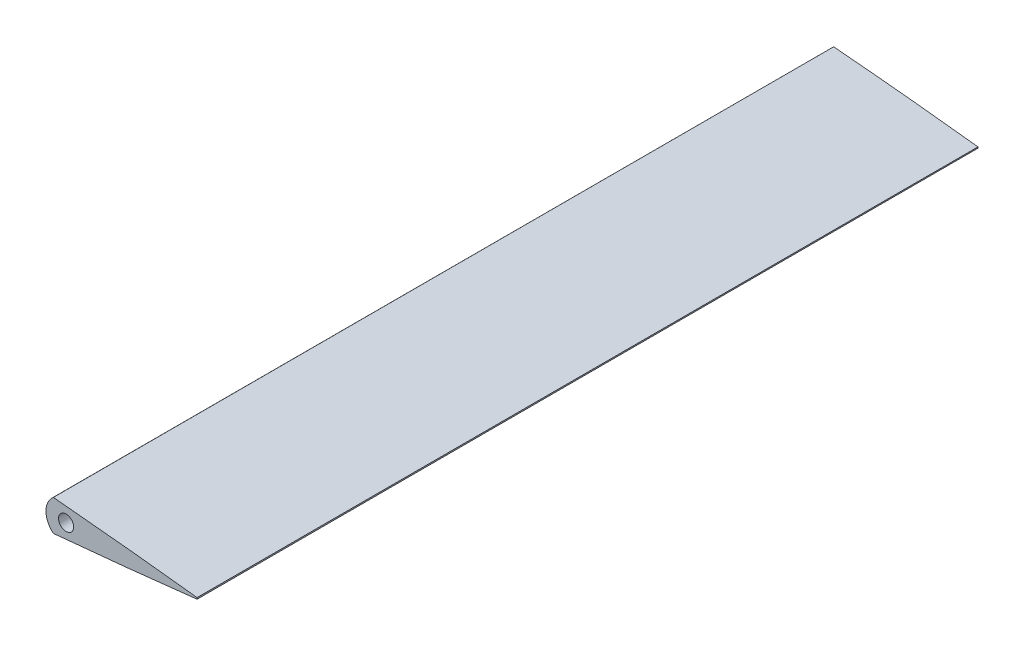
ISO-10303-21;
HEADER;
FILE_DESCRIPTION(('STEP AP214'),'2;1');
FILE_NAME('part.step','',(''),(''),'','','');
FILE_SCHEMA(('AUTOMOTIVE_DESIGN { 1 0 10303 214 1 1 1 1 }'));
ENDSEC;
DATA;
#1=APPLICATION_CONTEXT('core data for automotive mechanical design processes');
#2=APPLICATION_PROTOCOL_DEFINITION('international standard','automotive_design',2000,#1);
#3=PRODUCT_CONTEXT('',#1,'mechanical');
#4=PRODUCT('Part','Part','',(#3));
#5=PRODUCT_RELATED_PRODUCT_CATEGORY('part','',(#4));
#6=PRODUCT_DEFINITION_FORMATION('','',#4);
#7=PRODUCT_DEFINITION_CONTEXT('part definition',#1,'design');
#8=PRODUCT_DEFINITION('design','',#6,#7);
#9=PRODUCT_DEFINITION_SHAPE('','',#8);
#10=(LENGTH_UNIT() NAMED_UNIT(*) SI_UNIT(.MILLI.,.METRE.));
#11=(NAMED_UNIT(*) PLANE_ANGLE_UNIT() SI_UNIT($,.RADIAN.));
#12=(NAMED_UNIT(*) SI_UNIT($,.STERADIAN.) SOLID_ANGLE_UNIT());
#13=UNCERTAINTY_MEASURE_WITH_UNIT(LENGTH_MEASURE(1.E-05),#10,'distance_accuracy_value','');
#14=(GEOMETRIC_REPRESENTATION_CONTEXT(3) GLOBAL_UNCERTAINTY_ASSIGNED_CONTEXT((#13)) GLOBAL_UNIT_ASSIGNED_CONTEXT((#10,
#11,#12)) REPRESENTATION_CONTEXT('',''));
#15=CARTESIAN_POINT('',(0.,0.,0.));
#16=DIRECTION('',(0.,0.,1.));
#17=DIRECTION('',(1.,0.,0.));
#18=AXIS2_PLACEMENT_3D('',#15,#16,#17);
#19=CARTESIAN_POINT('',(70.,0.0735,0.));
#20=CARTESIAN_POINT('',(70.,0.05775,-90.));
#21=CARTESIAN_POINT('',(68.8335080399569,0.207369644620947,0.));
#22=CARTESIAN_POINT('',(69.0834706028233,0.162933292202173,-90.));
#23=CARTESIAN_POINT('',(66.5013366610328,0.475015684530368,0.));
#24=CARTESIAN_POINT('',(67.2510502336686,0.373226609273861,-90.));
#25=CARTESIAN_POINT('',(59.5068534375464,1.22059950301267,0.));
#26=CARTESIAN_POINT('',(61.7553848437865,0.959042466652812,-90.));
#27=CARTESIAN_POINT('',(51.3411291423464,1.97323482674955,0.));
#28=CARTESIAN_POINT('',(55.3394586118436,1.55039879244607,-90.));
#29=CARTESIAN_POINT('',(42.0033550763474,2.6781420115594,0.));
#30=CARTESIAN_POINT('',(48.0026361314158,2.10425443765382,-90.));
#31=CARTESIAN_POINT('',(35.0033276822841,3.10894088739879,0.));
#32=CARTESIAN_POINT('',(42.5026146075089,2.44273926867048,-90.));
#33=CARTESIAN_POINT('',(28.0028425035665,3.41546324526182,0.));
#34=CARTESIAN_POINT('',(37.0022333956594,2.68357826413429,-90.));
#35=CARTESIAN_POINT('',(20.9996176811236,3.54412790887703,0.));
#36=CARTESIAN_POINT('',(31.4996996065971,2.78467192840338,-90.));
#37=CARTESIAN_POINT('',(15.1621219043051,3.43896686269696,0.));
#38=CARTESIAN_POINT('',(26.913095781954,2.70204539211904,-90.));
#39=CARTESIAN_POINT('',(10.4932470006794,3.14283251784594,0.));
#40=CARTESIAN_POINT('',(23.2446940719624,2.46936840687895,-90.));
#41=CARTESIAN_POINT('',(7.57533938887657,2.83324720582861,0.));
#42=CARTESIAN_POINT('',(20.9520523769744,2.22612280457962,-90.));
#43=CARTESIAN_POINT('',(5.24030650692798,2.46209864989354,0.));
#44=CARTESIAN_POINT('',(19.1173836840148,1.93450608205921,-90.));
#45=CARTESIAN_POINT('',(3.48530508189471,2.09967851116287,0.));
#46=CARTESIAN_POINT('',(17.7384539929173,1.64974740162797,-90.));
#47=CARTESIAN_POINT('',(1.99314144537641,1.63920813156458,0.));
#48=CARTESIAN_POINT('',(16.5660397070815,1.28794924622931,-90.));
#49=CARTESIAN_POINT('',(0.755632776345661,1.11827318057108,0.));
#50=CARTESIAN_POINT('',(15.5937114671287,0.878643213305847,-90.));
#51=CARTESIAN_POINT('',(-0.447448608869755,0.,0.));
#52=CARTESIAN_POINT('',(14.648433235888,0.,-90.));
#53=CARTESIAN_POINT('',(0.755632776345677,-1.11827318057109,0.));
#54=CARTESIAN_POINT('',(15.5937114671287,-0.878643213305856,-90.));
#55=CARTESIAN_POINT('',(1.99314144537639,-1.63920813156457,0.));
#56=CARTESIAN_POINT('',(16.5660397070814,-1.2879492462293,-90.));
#57=CARTESIAN_POINT('',(3.48530508189473,-2.09967851116288,0.));
#58=CARTESIAN_POINT('',(17.7384539929173,-1.64974740162797,-90.));
#59=CARTESIAN_POINT('',(5.24030650692796,-2.46209864989353,0.));
#60=CARTESIAN_POINT('',(19.1173836840148,-1.93450608205921,-90.));
#61=CARTESIAN_POINT('',(7.57533938887658,-2.83324720582861,0.));
#62=CARTESIAN_POINT('',(20.9520523769745,-2.22612280457962,-90.));
#63=CARTESIAN_POINT('',(10.4932470006794,-3.14283251784594,0.));
#64=CARTESIAN_POINT('',(23.2446940719624,-2.46936840687895,-90.));
#65=CARTESIAN_POINT('',(15.1621219043051,-3.43896686269696,0.));
#66=CARTESIAN_POINT('',(26.913095781954,-2.70204539211904,-90.));
#67=CARTESIAN_POINT('',(20.9996176811236,-3.54412790887703,0.));
#68=CARTESIAN_POINT('',(31.4996996065971,-2.78467192840338,-90.));
#69=CARTESIAN_POINT('',(28.0028425035665,-3.41546324526182,0.));
#70=CARTESIAN_POINT('',(37.0022333956594,-2.68357826413429,-90.));
#71=CARTESIAN_POINT('',(35.0033276822841,-3.10894088739879,0.));
#72=CARTESIAN_POINT('',(42.5026146075089,-2.44273926867048,-90.));
#73=CARTESIAN_POINT('',(42.0033550763474,-2.6781420115594,0.));
#74=CARTESIAN_POINT('',(48.0026361314158,-2.10425443765382,-90.));
#75=CARTESIAN_POINT('',(51.3411291423464,-1.97323482674955,0.));
#76=CARTESIAN_POINT('',(55.3394586118436,-1.55039879244607,-90.));
#77=CARTESIAN_POINT('',(59.5068534375464,-1.22059950301267,0.));
#78=CARTESIAN_POINT('',(61.7553848437864,-0.959042466652813,-90.));
#79=CARTESIAN_POINT('',(66.5013366610328,-0.475015684530368,0.));
#80=CARTESIAN_POINT('',(67.2510502336687,-0.37322660927386,-90.));
#81=CARTESIAN_POINT('',(68.8335080399569,-0.207369644620947,0.));
#82=CARTESIAN_POINT('',(69.0834706028233,-0.162933292202173,-90.));
#83=CARTESIAN_POINT('',(70.,-0.0735,0.));
#84=CARTESIAN_POINT('',(70.,-0.05775,-90.));
#85=B_SPLINE_SURFACE_WITH_KNOTS('',3,1,((#19,#20),(#21,#22),(#23,#24),(#25,#26),(#27,#28),(#29,
#30),(#31,#32),(#33,#34),(#35,#36),(#37,#38),(#39,#40),(#41,#42),(#43,#44),(#45,#46),(#47,#48),
(#49,#50),(#51,#52),(#53,#54),(#55,#56),(#57,#58),(#59,#60),(#61,#62),(#63,#64),(#65,#66),(#67,
#68),(#69,#70),(#71,#72),(#73,#74),(#75,#76),(#77,#78),(#79,#80),(#81,#82),(#83,#84)),
.UNSPECIFIED.,.F.,.F.,.F.,(4,1,1,1,1,1,1,1,1,1,1,1,1,1,1,1,1,1,1,1,1,1,1,1,1,1,1,1,1,1,4),(2,2),
(0.,0.0248235560251693,0.0496298207515118,0.148712652883516,0.198182139774084,0.247604472837194,
0.296979942928689,0.34631759583347,0.395664019787251,0.420382181676291,0.445198050680487,
0.457689209223658,0.470304282792856,0.483229229601925,0.4900691736526,0.5,0.5099308263474,
0.516770770398075,0.529695717207144,0.542310790776342,0.554801949319513,0.579617818323709,
0.604335980212749,0.65368240416653,0.703020057071311,0.752395527162806,0.801817860225916,
0.851287347116484,0.950370179248488,0.975176443974831,1.),(0.,1.),.UNSPECIFIED.);
#86=CARTESIAN_POINT('',(70.,0.0713125,-12.5));
#87=CARTESIAN_POINT('',(69.7414668603145,0.100981916086082,-12.5));
#88=CARTESIAN_POINT('',(69.4829337650571,0.13065210410241,-12.5));
#89=CARTESIAN_POINT('',(68.9658547479038,0.189883642569296,-12.5));
#90=CARTESIAN_POINT('',(68.7073088259904,0.219444992867254,-12.5));
#91=CARTESIAN_POINT('',(68.190190113186,0.278348601581515,-12.5));
#92=CARTESIAN_POINT('',(67.9316173221159,0.307690858427433,-12.5));
#93=CARTESIAN_POINT('',(67.4144356798303,0.366054784643278,-12.5));
#94=CARTESIAN_POINT('',(67.1558268286363,0.395076454203484,-12.5));
#95=CARTESIAN_POINT('',(66.4168497463407,0.477342654393444,-12.5));
#96=CARTESIAN_POINT('',(65.9364188255895,0.530025469929151,-12.5));
#97=CARTESIAN_POINT('',(64.9753932126604,0.633878210319787,-12.5));
#98=CARTESIAN_POINT('',(64.4947985202807,0.685048133304497,-12.5));
#99=CARTESIAN_POINT('',(63.5334745181327,0.78612879173943,-12.5));
#100=CARTESIAN_POINT('',(63.0527452077217,0.83603952107079,-12.5));
#101=CARTESIAN_POINT('',(62.0911687260471,0.934709512589223,-12.5));
#102=CARTESIAN_POINT('',(61.6103215548279,0.983468775210374,-12.5));
#103=CARTESIAN_POINT('',(60.167607854686,1.1279992565301,-12.5));
#104=CARTESIAN_POINT('',(59.2055657951192,1.22202352007014,-12.5));
#105=CARTESIAN_POINT('',(57.281045651738,1.40545723685992,-12.5));
#106=CARTESIAN_POINT('',(56.318567569733,1.494866709087,-12.5));
#107=CARTESIAN_POINT('',(55.2372585228411,1.59271676313934,-12.5));
#108=CARTESIAN_POINT('',(55.1186308156068,1.60341653190522,-12.5));
#109=CARTESIAN_POINT('',(55.,1.61408149332983,-12.5));
#110=B_SPLINE_CURVE_WITH_KNOTS('',3,(#86,#87,#88,#89,#90,#91,#92,#93,#94,#95,#96,#97,#98,#99,
#100,#101,#102,#103,#104,#105,#106,#107,#108,#109),.UNSPECIFIED.,.F.,.F.,(4,2,2,2,2,2,2,2,2,2,2,
4),(0.,0.78069010694558,1.56138130808895,2.34207809959769,3.12277442771597,4.57270400076843,
6.02263536613116,7.47257377586181,8.92251163898835,11.8223772776405,14.7222309902626,
15.0795587743108),.UNSPECIFIED.);
#111=CARTESIAN_POINT('',(70.,0.0713125,-12.5));
#112=VERTEX_POINT('',#111);
#113=CARTESIAN_POINT('',(55.7332774056174,1.54771246324391,-12.5));
#114=VERTEX_POINT('',#113);
#115=EDGE_CURVE('E99',#112,#114,#110,.T.);
#116=DIRECTION('',(0.,-0.000174999997320312,-0.9999999846875));
#117=VECTOR('',#116,1.);
#118=CARTESIAN_POINT('',(70.,0.065625,-45.));
#119=LINE('',#118,#117);
#120=CARTESIAN_POINT('',(70.,0.0577500000000001,-90.));
#121=VERTEX_POINT('',#120);
#122=EDGE_CURVE('E268',#112,#121,#119,.T.);
#123=CARTESIAN_POINT('',(70.,0.05775,-90.));
#124=CARTESIAN_POINT('',(69.0834706028233,0.162933292202173,-90.));
#125=CARTESIAN_POINT('',(67.2510502336686,0.373226609273861,-90.));
#126=CARTESIAN_POINT('',(61.7553848437865,0.959042466652812,-90.));
#127=CARTESIAN_POINT('',(55.3394586118436,1.55039879244607,-90.));
#128=CARTESIAN_POINT('',(48.0026361314158,2.10425443765382,-90.));
#129=CARTESIAN_POINT('',(42.5026146075089,2.44273926867048,-90.));
#130=CARTESIAN_POINT('',(37.0022333956594,2.68357826413429,-90.));
#131=CARTESIAN_POINT('',(31.4996996065971,2.78467192840338,-90.));
#132=CARTESIAN_POINT('',(26.913095781954,2.70204539211904,-90.));
#133=CARTESIAN_POINT('',(23.2446940719624,2.46936840687895,-90.));
#134=CARTESIAN_POINT('',(20.9520523769744,2.22612280457962,-90.));
#135=CARTESIAN_POINT('',(19.1173836840148,1.93450608205921,-90.));
#136=CARTESIAN_POINT('',(17.7384539929173,1.64974740162797,-90.));
#137=CARTESIAN_POINT('',(16.5660397070815,1.28794924622931,-90.));
#138=CARTESIAN_POINT('',(15.5937114671287,0.878643213305847,-90.));
#139=CARTESIAN_POINT('',(14.648433235888,0.,-90.));
#140=CARTESIAN_POINT('',(15.5937114671287,-0.878643213305856,-90.));
#141=CARTESIAN_POINT('',(16.5660397070814,-1.2879492462293,-90.));
#142=CARTESIAN_POINT('',(17.7384539929173,-1.64974740162797,-90.));
#143=CARTESIAN_POINT('',(19.1173836840148,-1.93450608205921,-90.));
#144=CARTESIAN_POINT('',(20.9520523769745,-2.22612280457962,-90.));
#145=CARTESIAN_POINT('',(23.2446940719624,-2.46936840687895,-90.));
#146=CARTESIAN_POINT('',(26.913095781954,-2.70204539211904,-90.));
#147=CARTESIAN_POINT('',(31.4996996065971,-2.78467192840338,-90.));
#148=CARTESIAN_POINT('',(37.0022333956594,-2.68357826413429,-90.));
#149=CARTESIAN_POINT('',(42.5026146075089,-2.44273926867048,-90.));
#150=CARTESIAN_POINT('',(48.0026361314158,-2.10425443765382,-90.));
#151=CARTESIAN_POINT('',(55.3394586118436,-1.55039879244607,-90.));
#152=CARTESIAN_POINT('',(61.7553848437864,-0.959042466652813,-90.));
#153=CARTESIAN_POINT('',(67.2510502336687,-0.37322660927386,-90.));
#154=CARTESIAN_POINT('',(69.0834706028233,-0.162933292202173,-90.));
#155=CARTESIAN_POINT('',(70.,-0.05775,-90.));
#156=B_SPLINE_CURVE_WITH_KNOTS('',3,(#123,#124,#125,#126,#127,#128,#129,#130,#131,#132,#133,
#134,#135,#136,#137,#138,#139,#140,#141,#142,#143,#144,#145,#146,#147,#148,#149,#150,#151,#152,
#153,#154,#155),.UNSPECIFIED.,.F.,.F.,(4,1,1,1,1,1,1,1,1,1,1,1,1,1,1,1,1,1,1,1,1,1,1,1,1,1,1,1,
1,1,4),(0.,0.0248235560251693,0.0496298207515118,0.148712652883516,0.198182139774084,
0.247604472837194,0.296979942928689,0.34631759583347,0.395664019787251,0.420382181676291,
0.445198050680487,0.457689209223658,0.470304282792856,0.483229229601925,0.4900691736526,0.5,
0.5099308263474,0.516770770398075,0.529695717207144,0.542310790776342,0.554801949319513,
0.579617818323709,0.604335980212749,0.65368240416653,0.703020057071311,0.752395527162806,
0.801817860225916,0.851287347116484,0.950370179248488,0.975176443974831,1.),.UNSPECIFIED.);
#157=CARTESIAN_POINT('',(55.674911850337,1.49804585898522,-90.));
#158=VERTEX_POINT('',#157);
#159=EDGE_CURVE('E271',#121,#158,#156,.T.);
#160=CARTESIAN_POINT('',(55.7332774056173,1.54771246324383,-12.5));
#161=CARTESIAN_POINT('',(55.7325816923888,1.54714305595791,-13.5409232799796));
#162=CARTESIAN_POINT('',(55.7318830577461,1.54657047711314,-14.5818465563066));
#163=CARTESIAN_POINT('',(55.7283749388779,1.54369132323435,-19.7864629195761));
#164=CARTESIAN_POINT('',(55.7255206176885,1.54133596923636,-23.9501559496188));
#165=CARTESIAN_POINT('',(55.7168011742141,1.53409838311264,-36.4412348359579));
#166=CARTESIAN_POINT('',(55.7107795720261,1.52904462685996,-44.7686204831821));
#167=CARTESIAN_POINT('',(55.695246826309,1.51583916169482,-65.3966666433509));
#168=CARTESIAN_POINT('',(55.6854415621367,1.50735983584898,-77.6973267381479));
#169=CARTESIAN_POINT('',(55.6749129997613,1.49804687570146,-89.99865704669));
#170=CARTESIAN_POINT('',(55.6749124250502,1.49804636734458,-89.999328523345));
#171=CARTESIAN_POINT('',(55.674911850337,1.49804585898522,-90.));
#172=B_SPLINE_CURVE_WITH_KNOTS('',3,(#160,#161,#162,#163,#164,#165,#166,#167,#168,#169,#170,
#171),.UNSPECIFIED.,.F.,.F.,(4,2,2,2,2,4),(0.,3.1227710047178,15.6138550253942,40.5960230825963,
77.4980236696743,77.5000381009545),.UNSPECIFIED.);
#173=EDGE_CURVE('E86',#114,#158,#172,.T.);
#174=ORIENTED_EDGE('',*,*,#115,.F.);
#175=ORIENTED_EDGE('',*,*,#122,.T.);
#176=ORIENTED_EDGE('',*,*,#159,.T.);
#177=ORIENTED_EDGE('',*,*,#173,.F.);
#178=EDGE_LOOP('',(#174,#175,#176,#177));
#179=FACE_BOUND('',#178,.T.);
#180=ADVANCED_FACE('F39',(#179),#85,.F.);
#181=CARTESIAN_POINT('',(70.,0.05775,-90.));
#182=CARTESIAN_POINT('',(69.0834706028233,0.162933292202173,-90.));
#183=CARTESIAN_POINT('',(67.2510502336686,0.373226609273861,-90.));
#184=CARTESIAN_POINT('',(61.7553848437865,0.959042466652812,-90.));
#185=CARTESIAN_POINT('',(55.3394586118436,1.55039879244607,-90.));
#186=CARTESIAN_POINT('',(48.0026361314158,2.10425443765382,-90.));
#187=CARTESIAN_POINT('',(42.5026146075089,2.44273926867048,-90.));
#188=CARTESIAN_POINT('',(37.0022333956594,2.68357826413429,-90.));
#189=CARTESIAN_POINT('',(31.4996996065971,2.78467192840338,-90.));
#190=CARTESIAN_POINT('',(26.913095781954,2.70204539211904,-90.));
#191=CARTESIAN_POINT('',(23.2446940719624,2.46936840687895,-90.));
#192=CARTESIAN_POINT('',(20.9520523769744,2.22612280457962,-90.));
#193=CARTESIAN_POINT('',(19.1173836840148,1.93450608205921,-90.));
#194=CARTESIAN_POINT('',(17.7384539929173,1.64974740162797,-90.));
#195=CARTESIAN_POINT('',(16.5660397070815,1.28794924622931,-90.));
#196=CARTESIAN_POINT('',(15.5937114671287,0.878643213305847,-90.));
#197=CARTESIAN_POINT('',(14.648433235888,0.,-90.));
#198=CARTESIAN_POINT('',(15.5937114671287,-0.878643213305856,-90.));
#199=CARTESIAN_POINT('',(16.5660397070814,-1.2879492462293,-90.));
#200=CARTESIAN_POINT('',(17.7384539929173,-1.64974740162797,-90.));
#201=CARTESIAN_POINT('',(19.1173836840148,-1.93450608205921,-90.));
#202=CARTESIAN_POINT('',(20.9520523769745,-2.22612280457962,-90.));
#203=CARTESIAN_POINT('',(23.2446940719624,-2.46936840687895,-90.));
#204=CARTESIAN_POINT('',(26.913095781954,-2.70204539211904,-90.));
#205=CARTESIAN_POINT('',(31.4996996065971,-2.78467192840338,-90.));
#206=CARTESIAN_POINT('',(37.0022333956594,-2.68357826413429,-90.));
#207=CARTESIAN_POINT('',(42.5026146075089,-2.44273926867048,-90.));
#208=CARTESIAN_POINT('',(48.0026361314158,-2.10425443765382,-90.));
#209=CARTESIAN_POINT('',(55.3394586118436,-1.55039879244607,-90.));
#210=CARTESIAN_POINT('',(61.7553848437864,-0.959042466652813,-90.));
#211=CARTESIAN_POINT('',(67.2510502336687,-0.37322660927386,-90.));
#212=CARTESIAN_POINT('',(69.0834706028233,-0.162933292202173,-90.));
#213=CARTESIAN_POINT('',(70.,-0.05775,-90.));
#214=B_SPLINE_CURVE_WITH_KNOTS('',3,(#181,#182,#183,#184,#185,#186,#187,#188,#189,#190,#191,
#192,#193,#194,#195,#196,#197,#198,#199,#200,#201,#202,#203,#204,#205,#206,#207,#208,#209,#210,
#211,#212,#213),.UNSPECIFIED.,.F.,.F.,(4,1,1,1,1,1,1,1,1,1,1,1,1,1,1,1,1,1,1,1,1,1,1,1,1,1,1,1,
1,1,4),(0.,0.0248235560251693,0.0496298207515118,0.148712652883516,0.198182139774084,
0.247604472837194,0.296979942928689,0.34631759583347,0.395664019787251,0.420382181676291,
0.445198050680487,0.457689209223658,0.470304282792856,0.483229229601925,0.4900691736526,0.5,
0.5099308263474,0.516770770398075,0.529695717207144,0.542310790776342,0.554801949319513,
0.579617818323709,0.604335980212749,0.65368240416653,0.703020057071311,0.752395527162806,
0.801817860225916,0.851287347116484,0.950370179248488,0.975176443974831,1.),.UNSPECIFIED.);
#215=CARTESIAN_POINT('',(70.,-0.0577500000000001,-90.));
#216=VERTEX_POINT('',#215);
#217=CARTESIAN_POINT('',(55.674911850337,-1.49804585898522,-90.));
#218=VERTEX_POINT('',#217);
#219=EDGE_CURVE('E94',#216,#218,#214,.F.);
#220=DIRECTION('',(0.,0.000174999997320312,-0.9999999846875));
#221=VECTOR('',#220,1.);
#222=CARTESIAN_POINT('',(70.,-0.065625,-45.));
#223=LINE('',#222,#221);
#224=CARTESIAN_POINT('',(70.,-0.0713125,-12.5));
#225=VERTEX_POINT('',#224);
#226=EDGE_CURVE('E267',#225,#216,#223,.T.);
#227=CARTESIAN_POINT('',(55.,-1.61408149332983,-12.5));
#228=CARTESIAN_POINT('',(55.5183780350899,-1.56747891192403,-12.5));
#229=CARTESIAN_POINT('',(56.0366963898853,-1.52021218195693,-12.5));
#230=CARTESIAN_POINT('',(57.0732007784242,-1.42434609967408,-12.5));
#231=CARTESIAN_POINT('',(57.5913868143065,-1.37574677048342,-12.5));
#232=CARTESIAN_POINT('',(58.6054541880147,-1.27931841225787,-12.5));
#233=CARTESIAN_POINT('',(59.1013408581558,-1.23154545207752,-12.5));
#234=CARTESIAN_POINT('',(60.092994600922,-1.1347705358797,-12.5));
#235=CARTESIAN_POINT('',(60.5887616734694,-1.08576857906489,-12.5));
#236=CARTESIAN_POINT('',(61.5801722263845,-0.986525074405809,-12.5));
#237=CARTESIAN_POINT('',(62.0758157066272,-0.936283525312713,-12.5));
#238=CARTESIAN_POINT('',(63.0669771425359,-0.834580555653539,-12.5));
#239=CARTESIAN_POINT('',(63.5624950982907,-0.783119135953356,-12.5));
#240=CARTESIAN_POINT('',(64.5534214105152,-0.678839130042894,-12.5));
#241=CARTESIAN_POINT('',(65.0488297576427,-0.626020454868466,-12.5));
#242=CARTESIAN_POINT('',(65.7918136206989,-0.545602142026094,-12.5));
#243=CARTESIAN_POINT('',(66.03945361459,-0.518597637771891,-12.5));
#244=CARTESIAN_POINT('',(66.5346856922664,-0.464152825523873,-12.5));
#245=CARTESIAN_POINT('',(66.7822777760586,-0.436712517593294,-12.5));
#246=CARTESIAN_POINT('',(67.5249896274649,-0.353810211087082,-12.5));
#247=CARTESIAN_POINT('',(68.0200443231144,-0.297766902676286,-12.5));
#248=CARTESIAN_POINT('',(69.0100660571453,-0.184916245074303,-12.5));
#249=CARTESIAN_POINT('',(69.5050330956602,-0.128108897057249,-12.5));
#250=CARTESIAN_POINT('',(70.,-0.0713125,-12.5));
#251=B_SPLINE_CURVE_WITH_KNOTS('',3,(#227,#228,#229,#230,#231,#232,#233,#234,#235,#236,#237,
#238,#239,#240,#241,#242,#243,#244,#245,#246,#247,#248,#249,#250),.UNSPECIFIED.,.F.,.F.,(4,2,2,
2,2,2,2,2,2,2,2,4),(0.,1.56140548866715,3.12278389879952,4.61733001344123,6.11187709774135,
7.6064256877913,9.10097321700452,10.5956189606144,11.3429427328275,12.0902663966015,
13.5849157519404,15.0795628106485),.UNSPECIFIED.);
#252=CARTESIAN_POINT('',(55.7332774056173,-1.54771246324383,-12.5));
#253=VERTEX_POINT('',#252);
#254=EDGE_CURVE('E95',#253,#225,#251,.T.);
#255=CARTESIAN_POINT('',(55.674911850337,-1.49804585898522,-90.));
#256=CARTESIAN_POINT('',(55.6758027751405,-1.49883392326514,-88.9590770113425));
#257=CARTESIAN_POINT('',(55.6766884734431,-1.49961594691833,-87.9181540136146));
#258=CARTESIAN_POINT('',(55.6810914779114,-1.50349670084155,-82.7135389797496));
#259=CARTESIAN_POINT('',(55.6845323229383,-1.50650733807979,-78.5498468127593));
#260=CARTESIAN_POINT('',(55.6946349679665,-1.51528956162535,-66.058769952649));
#261=CARTESIAN_POINT('',(55.701076877909,-1.52081145975798,-57.7313849074102));
#262=CARTESIAN_POINT('',(55.7164262706402,-1.53381164588623,-37.1026670011916));
#263=CARTESIAN_POINT('',(55.7250433215599,-1.54096603009734,-24.8013337153263));
#264=CARTESIAN_POINT('',(55.7332774056172,-1.54771246324383,-12.5));
#265=B_SPLINE_CURVE_WITH_KNOTS('',3,(#255,#256,#257,#258,#259,#260,#261,#262,#263,#264),
.UNSPECIFIED.,.F.,.F.,(4,2,2,2,4),(0.,3.12277100478067,15.613855028726,40.5960230976778,
77.5000381147407),.UNSPECIFIED.);
#266=EDGE_CURVE('E83',#218,#253,#265,.T.);
#267=ORIENTED_EDGE('',*,*,#219,.F.);
#268=ORIENTED_EDGE('',*,*,#226,.F.);
#269=ORIENTED_EDGE('',*,*,#254,.F.);
#270=ORIENTED_EDGE('',*,*,#266,.F.);
#271=EDGE_LOOP('',(#267,#268,#269,#270));
#272=FACE_BOUND('',#271,.T.);
#273=ADVANCED_FACE('F92',(#272),#85,.F.);
#274=CARTESIAN_POINT('',(55.,-4.68748352412842,-90.));
#275=DIRECTION('',(0.,0.,-1.));
#276=DIRECTION('',(1.,0.,0.));
#277=AXIS2_PLACEMENT_3D('',#274,#275,#276);
#278=PLANE('',#277);
#279=CARTESIAN_POINT('',(57.,0.,-90.));
#280=DIRECTION('',(0.,0.,1.));
#281=DIRECTION('',(1.,0.,0.));
#282=AXIS2_PLACEMENT_3D('',#279,#280,#281);
#283=CIRCLE('',#282,0.749999999999999);
#284=CARTESIAN_POINT('',(57.75,0.,-90.));
#285=VERTEX_POINT('',#284);
#286=EDGE_CURVE('E168',#285,#285,#283,.T.);
#287=ORIENTED_EDGE('',*,*,#286,.T.);
#288=EDGE_LOOP('',(#287));
#289=FACE_BOUND('',#288,.T.);
#290=ORIENTED_EDGE('',*,*,#159,.F.);
#291=DIRECTION('',(0.,1.,0.));
#292=VECTOR('',#291,1.);
#293=CARTESIAN_POINT('',(70.,-3.54412790887703,-90.));
#294=LINE('',#293,#292);
#295=EDGE_CURVE('E54',#216,#121,#294,.T.);
#296=ORIENTED_EDGE('',*,*,#295,.F.);
#297=ORIENTED_EDGE('',*,*,#219,.T.);
#298=CARTESIAN_POINT('',(57.,0.,-90.));
#299=DIRECTION('',(0.,0.,-1.));
#300=DIRECTION('',(1.,0.,0.));
#301=AXIS2_PLACEMENT_3D('',#298,#299,#300);
#302=CIRCLE('',#301,2.);
#303=EDGE_CURVE('E80',#218,#158,#302,.T.);
#304=ORIENTED_EDGE('',*,*,#303,.T.);
#305=EDGE_LOOP('',(#290,#296,#297,#304));
#306=FACE_BOUND('',#305,.T.);
#307=ADVANCED_FACE('F97',(#289,#306),#278,.T.);
#308=CARTESIAN_POINT('',(55.,-4.68748352412842,-12.5));
#309=DIRECTION('',(0.,0.,1.));
#310=DIRECTION('',(-1.,0.,0.));
#311=AXIS2_PLACEMENT_3D('',#308,#309,#310);
#312=PLANE('',#311);
#313=CARTESIAN_POINT('',(57.,0.,-12.5));
#314=DIRECTION('',(0.,0.,-1.));
#315=DIRECTION('',(-1.,0.,0.));
#316=AXIS2_PLACEMENT_3D('',#313,#314,#315);
#317=CIRCLE('',#316,0.749999999999999);
#318=CARTESIAN_POINT('',(56.25,0.,-12.5));
#319=VERTEX_POINT('',#318);
#320=EDGE_CURVE('E169',#319,#319,#317,.T.);
#321=ORIENTED_EDGE('',*,*,#320,.T.);
#322=EDGE_LOOP('',(#321));
#323=FACE_BOUND('',#322,.T.);
#324=CARTESIAN_POINT('',(57.,0.,-12.5));
#325=DIRECTION('',(0.,0.,-1.));
#326=DIRECTION('',(-1.,0.,0.));
#327=AXIS2_PLACEMENT_3D('',#324,#325,#326);
#328=CIRCLE('',#327,2.);
#329=EDGE_CURVE('E11',#253,#114,#328,.T.);
#330=ORIENTED_EDGE('',*,*,#329,.F.);
#331=ORIENTED_EDGE('',*,*,#254,.T.);
#332=DIRECTION('',(0.,1.,0.));
#333=VECTOR('',#332,1.);
#334=CARTESIAN_POINT('',(70.,-0.0735,-12.5));
#335=LINE('',#334,#333);
#336=EDGE_CURVE('E47',#225,#112,#335,.T.);
#337=ORIENTED_EDGE('',*,*,#336,.T.);
#338=ORIENTED_EDGE('',*,*,#115,.T.);
#339=EDGE_LOOP('',(#330,#331,#337,#338));
#340=FACE_BOUND('',#339,.T.);
#341=ADVANCED_FACE('F123',(#323,#340),#312,.T.);
#342=CARTESIAN_POINT('',(70.,-0.0735,0.));
#343=DIRECTION('',(1.,0.,0.));
#344=DIRECTION('',(0.,1.,0.));
#345=AXIS2_PLACEMENT_3D('',#342,#343,#344);
#346=PLANE('',#345);
#347=ORIENTED_EDGE('',*,*,#226,.T.);
#348=ORIENTED_EDGE('',*,*,#295,.T.);
#349=ORIENTED_EDGE('',*,*,#122,.F.);
#350=ORIENTED_EDGE('',*,*,#336,.F.);
#351=EDGE_LOOP('',(#347,#348,#349,#350));
#352=FACE_BOUND('',#351,.T.);
#353=ADVANCED_FACE('F41',(#352),#346,.T.);
#354=CARTESIAN_POINT('',(57.,0.,-90.));
#355=DIRECTION('',(0.,0.,1.));
#356=DIRECTION('',(-1.,0.,0.));
#357=AXIS2_PLACEMENT_3D('',#354,#355,#356);
#358=CYLINDRICAL_SURFACE('',#357,2.);
#359=ORIENTED_EDGE('',*,*,#266,.T.);
#360=ORIENTED_EDGE('',*,*,#329,.T.);
#361=ORIENTED_EDGE('',*,*,#173,.T.);
#362=ORIENTED_EDGE('',*,*,#303,.F.);
#363=EDGE_LOOP('',(#359,#360,#361,#362));
#364=FACE_BOUND('',#363,.T.);
#365=ADVANCED_FACE('F82',(#364),#358,.T.);
#366=CARTESIAN_POINT('',(57.,0.,-80.));
#367=DIRECTION('',(0.,0.,-1.));
#368=DIRECTION('',(1.,0.,0.));
#369=AXIS2_PLACEMENT_3D('',#366,#367,#368);
#370=CYLINDRICAL_SURFACE('',#369,0.749999999999999);
#371=CARTESIAN_POINT('',(57.,0.,-80.));
#372=DIRECTION('',(0.,0.,1.));
#373=DIRECTION('',(1.,0.,0.));
#374=AXIS2_PLACEMENT_3D('',#371,#372,#373);
#375=CIRCLE('',#374,0.749999999999999);
#376=CARTESIAN_POINT('',(57.75,0.,-80.));
#377=VERTEX_POINT('',#376);
#378=EDGE_CURVE('E88',#377,#377,#375,.T.);
#379=ORIENTED_EDGE('',*,*,#378,.T.);
#380=EDGE_LOOP('',(#379));
#381=FACE_BOUND('',#380,.T.);
#382=ORIENTED_EDGE('',*,*,#286,.F.);
#383=EDGE_LOOP('',(#382));
#384=FACE_BOUND('',#383,.T.);
#385=ADVANCED_FACE('F147',(#381,#384),#370,.F.);
#386=CARTESIAN_POINT('',(57.,0.,-80.));
#387=DIRECTION('',(0.,0.,-1.));
#388=DIRECTION('',(1.,0.,0.));
#389=AXIS2_PLACEMENT_3D('',#386,#387,#388);
#390=PLANE('',#389);
#391=ORIENTED_EDGE('',*,*,#378,.F.);
#392=EDGE_LOOP('',(#391));
#393=FACE_BOUND('',#392,.T.);
#394=ADVANCED_FACE('F151',(#393),#390,.T.);
#395=CARTESIAN_POINT('',(57.,0.,-22.5));
#396=DIRECTION('',(0.,0.,1.));
#397=DIRECTION('',(-1.,0.,0.));
#398=AXIS2_PLACEMENT_3D('',#395,#396,#397);
#399=CYLINDRICAL_SURFACE('',#398,0.749999999999999);
#400=CARTESIAN_POINT('',(57.,0.,-22.5));
#401=DIRECTION('',(0.,0.,-1.));
#402=DIRECTION('',(-1.,0.,0.));
#403=AXIS2_PLACEMENT_3D('',#400,#401,#402);
#404=CIRCLE('',#403,0.749999999999999);
#405=CARTESIAN_POINT('',(56.25,0.,-22.5));
#406=VERTEX_POINT('',#405);
#407=EDGE_CURVE('E167',#406,#406,#404,.T.);
#408=ORIENTED_EDGE('',*,*,#407,.T.);
#409=EDGE_LOOP('',(#408));
#410=FACE_BOUND('',#409,.T.);
#411=ORIENTED_EDGE('',*,*,#320,.F.);
#412=EDGE_LOOP('',(#411));
#413=FACE_BOUND('',#412,.T.);
#414=ADVANCED_FACE('F155',(#410,#413),#399,.F.);
#415=CARTESIAN_POINT('',(57.,0.,-22.5));
#416=DIRECTION('',(0.,0.,1.));
#417=DIRECTION('',(-1.,0.,0.));
#418=AXIS2_PLACEMENT_3D('',#415,#416,#417);
#419=PLANE('',#418);
#420=ORIENTED_EDGE('',*,*,#407,.F.);
#421=EDGE_LOOP('',(#420));
#422=FACE_BOUND('',#421,.T.);
#423=ADVANCED_FACE('F159',(#422),#419,.T.);
#424=CLOSED_SHELL('',(#180,#273,#307,#341,#353,#365,#385,#394,#414,#423));
#425=MANIFOLD_SOLID_BREP('B2',#424);
#426=ADVANCED_BREP_SHAPE_REPRESENTATION('',(#18,#425),#14);
#427=SHAPE_DEFINITION_REPRESENTATION(#9,#426);
ENDSEC;
END-ISO-10303-21;
